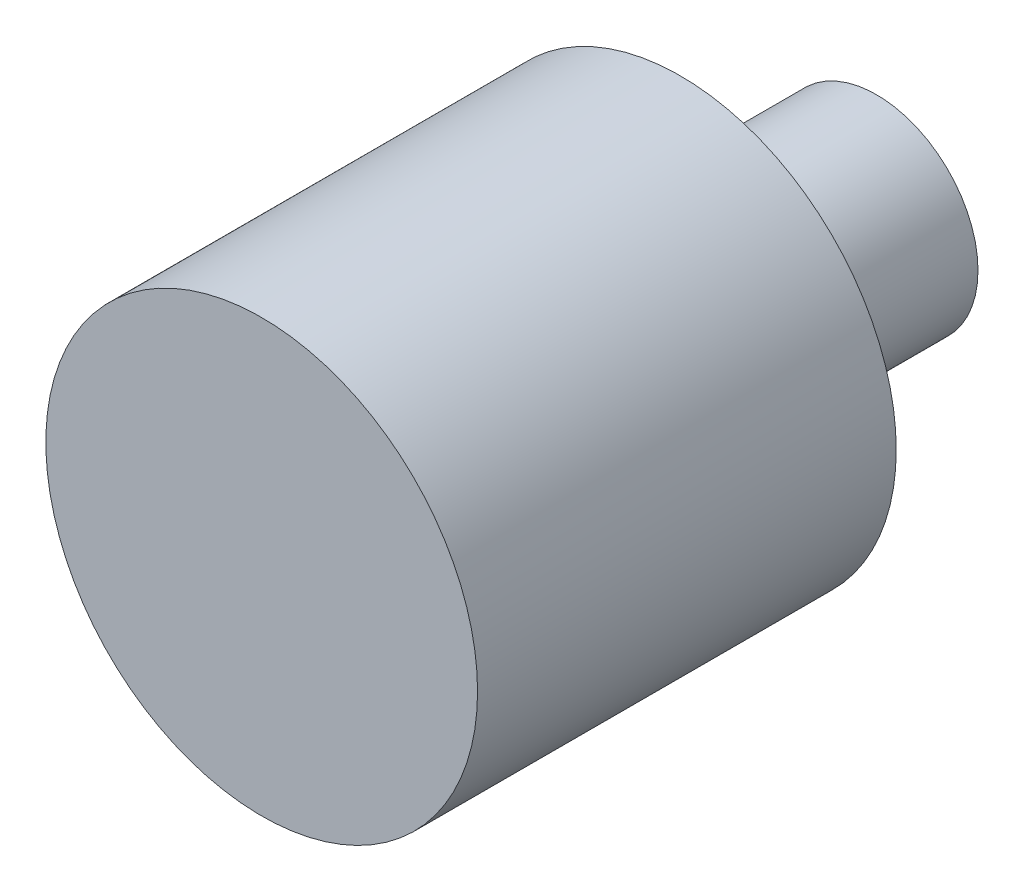
ISO-10303-21;
HEADER;
FILE_DESCRIPTION(('STEP AP214'),'2;1');
FILE_NAME('part.step','',(''),(''),'','','');
FILE_SCHEMA(('AUTOMOTIVE_DESIGN { 1 0 10303 214 1 1 1 1 }'));
ENDSEC;
DATA;
#1=APPLICATION_CONTEXT('core data for automotive mechanical design processes');
#2=APPLICATION_PROTOCOL_DEFINITION('international standard','automotive_design',2000,#1);
#3=PRODUCT_CONTEXT('',#1,'mechanical');
#4=PRODUCT('Part','Part','',(#3));
#5=PRODUCT_RELATED_PRODUCT_CATEGORY('part','',(#4));
#6=PRODUCT_DEFINITION_FORMATION('','',#4);
#7=PRODUCT_DEFINITION_CONTEXT('part definition',#1,'design');
#8=PRODUCT_DEFINITION('design','',#6,#7);
#9=PRODUCT_DEFINITION_SHAPE('','',#8);
#10=(LENGTH_UNIT() NAMED_UNIT(*) SI_UNIT(.MILLI.,.METRE.));
#11=(NAMED_UNIT(*) PLANE_ANGLE_UNIT() SI_UNIT($,.RADIAN.));
#12=(NAMED_UNIT(*) SI_UNIT($,.STERADIAN.) SOLID_ANGLE_UNIT());
#13=UNCERTAINTY_MEASURE_WITH_UNIT(LENGTH_MEASURE(1.E-05),#10,'distance_accuracy_value','');
#14=(GEOMETRIC_REPRESENTATION_CONTEXT(3) GLOBAL_UNCERTAINTY_ASSIGNED_CONTEXT((#13)) GLOBAL_UNIT_ASSIGNED_CONTEXT((#10,
#11,#12)) REPRESENTATION_CONTEXT('',''));
#15=CARTESIAN_POINT('',(0.,0.,0.));
#16=DIRECTION('',(0.,0.,1.));
#17=DIRECTION('',(1.,0.,0.));
#18=AXIS2_PLACEMENT_3D('',#15,#16,#17);
#19=CARTESIAN_POINT('',(0.,0.,-15.));
#20=DIRECTION('',(0.,0.,1.));
#21=DIRECTION('',(1.,0.,0.));
#22=AXIS2_PLACEMENT_3D('',#19,#20,#21);
#23=CYLINDRICAL_SURFACE('',#22,3.);
#24=CARTESIAN_POINT('',(0.,0.,0.));
#25=DIRECTION('',(0.,0.,1.));
#26=DIRECTION('',(1.,0.,0.));
#27=AXIS2_PLACEMENT_3D('',#24,#25,#26);
#28=CIRCLE('',#27,3.);
#29=CARTESIAN_POINT('',(3.,0.,0.));
#30=VERTEX_POINT('',#29);
#31=EDGE_CURVE('E47',#30,#30,#28,.F.);
#32=ORIENTED_EDGE('',*,*,#31,.T.);
#33=EDGE_LOOP('',(#32));
#34=FACE_BOUND('',#33,.T.);
#35=CARTESIAN_POINT('',(0.,0.,-4.));
#36=DIRECTION('',(0.,0.,-1.));
#37=DIRECTION('',(-1.,0.,0.));
#38=AXIS2_PLACEMENT_3D('',#35,#36,#37);
#39=CIRCLE('',#38,3.);
#40=CARTESIAN_POINT('',(-3.,0.,-4.));
#41=VERTEX_POINT('',#40);
#42=EDGE_CURVE('E11',#41,#41,#39,.T.);
#43=ORIENTED_EDGE('',*,*,#42,.F.);
#44=EDGE_LOOP('',(#43));
#45=FACE_BOUND('',#44,.T.);
#46=ADVANCED_FACE('F39',(#34,#45),#23,.T.);
#47=CARTESIAN_POINT('',(0.,0.,0.));
#48=DIRECTION('',(0.,0.,1.));
#49=DIRECTION('',(1.,0.,0.));
#50=AXIS2_PLACEMENT_3D('',#47,#48,#49);
#51=PLANE('',#50);
#52=CARTESIAN_POINT('',(0.,12.5,0.));
#53=DIRECTION('',(0.,0.,-1.));
#54=DIRECTION('',(-1.,0.,0.));
#55=AXIS2_PLACEMENT_3D('',#52,#53,#54);
#56=CIRCLE('',#55,1.24999999999999);
#57=CARTESIAN_POINT('',(-1.24999999999999,12.5,0.));
#58=VERTEX_POINT('',#57);
#59=EDGE_CURVE('E71',#58,#58,#56,.T.);
#60=ORIENTED_EDGE('',*,*,#59,.F.);
#61=EDGE_LOOP('',(#60));
#62=FACE_BOUND('',#61,.T.);
#63=CARTESIAN_POINT('',(-12.5,0.,0.));
#64=DIRECTION('',(0.,0.,-1.));
#65=DIRECTION('',(-1.,0.,0.));
#66=AXIS2_PLACEMENT_3D('',#63,#64,#65);
#67=CIRCLE('',#66,1.24999999999999);
#68=CARTESIAN_POINT('',(-13.75,0.,0.));
#69=VERTEX_POINT('',#68);
#70=EDGE_CURVE('E70',#69,#69,#67,.T.);
#71=ORIENTED_EDGE('',*,*,#70,.F.);
#72=EDGE_LOOP('',(#71));
#73=FACE_BOUND('',#72,.T.);
#74=CARTESIAN_POINT('',(0.,-12.5,0.));
#75=DIRECTION('',(0.,0.,-1.));
#76=DIRECTION('',(-1.,0.,0.));
#77=AXIS2_PLACEMENT_3D('',#74,#75,#76);
#78=CIRCLE('',#77,1.24999999999999);
#79=CARTESIAN_POINT('',(-1.24999999999999,-12.5,0.));
#80=VERTEX_POINT('',#79);
#81=EDGE_CURVE('E83',#80,#80,#78,.T.);
#82=ORIENTED_EDGE('',*,*,#81,.F.);
#83=EDGE_LOOP('',(#82));
#84=FACE_BOUND('',#83,.T.);
#85=CARTESIAN_POINT('',(12.5,0.,0.));
#86=DIRECTION('',(0.,0.,-1.));
#87=DIRECTION('',(-1.,0.,0.));
#88=AXIS2_PLACEMENT_3D('',#85,#86,#87);
#89=CIRCLE('',#88,1.24999999999999);
#90=CARTESIAN_POINT('',(11.25,0.,0.));
#91=VERTEX_POINT('',#90);
#92=EDGE_CURVE('E90',#91,#91,#89,.T.);
#93=ORIENTED_EDGE('',*,*,#92,.F.);
#94=EDGE_LOOP('',(#93));
#95=FACE_BOUND('',#94,.T.);
#96=CARTESIAN_POINT('',(0.,0.,0.));
#97=DIRECTION('',(0.,0.,1.));
#98=DIRECTION('',(1.,0.,0.));
#99=AXIS2_PLACEMENT_3D('',#96,#97,#98);
#100=CIRCLE('',#99,16.5);
#101=CARTESIAN_POINT('',(16.5,0.,0.));
#102=VERTEX_POINT('',#101);
#103=EDGE_CURVE('E96',#102,#102,#100,.T.);
#104=ORIENTED_EDGE('',*,*,#103,.F.);
#105=EDGE_LOOP('',(#104));
#106=FACE_BOUND('',#105,.T.);
#107=ORIENTED_EDGE('',*,*,#31,.F.);
#108=EDGE_LOOP('',(#107));
#109=FACE_BOUND('',#108,.T.);
#110=ADVANCED_FACE('F107',(#62,#73,#84,#95,#106,#109),#51,.F.);
#111=CARTESIAN_POINT('',(0.,0.,32.));
#112=DIRECTION('',(0.,0.,-1.));
#113=DIRECTION('',(-1.,0.,0.));
#114=AXIS2_PLACEMENT_3D('',#111,#112,#113);
#115=CYLINDRICAL_SURFACE('',#114,16.5);
#116=CARTESIAN_POINT('',(0.,0.,32.));
#117=DIRECTION('',(0.,0.,1.));
#118=DIRECTION('',(1.,0.,0.));
#119=AXIS2_PLACEMENT_3D('',#116,#117,#118);
#120=CIRCLE('',#119,16.5);
#121=CARTESIAN_POINT('',(16.5,0.,32.));
#122=VERTEX_POINT('',#121);
#123=EDGE_CURVE('E97',#122,#122,#120,.T.);
#124=ORIENTED_EDGE('',*,*,#123,.F.);
#125=EDGE_LOOP('',(#124));
#126=FACE_BOUND('',#125,.T.);
#127=ORIENTED_EDGE('',*,*,#103,.T.);
#128=EDGE_LOOP('',(#127));
#129=FACE_BOUND('',#128,.T.);
#130=ADVANCED_FACE('F41',(#126,#129),#115,.T.);
#131=CARTESIAN_POINT('',(0.,0.,32.));
#132=DIRECTION('',(0.,0.,1.));
#133=DIRECTION('',(1.,0.,0.));
#134=AXIS2_PLACEMENT_3D('',#131,#132,#133);
#135=PLANE('',#134);
#136=ORIENTED_EDGE('',*,*,#123,.T.);
#137=EDGE_LOOP('',(#136));
#138=FACE_BOUND('',#137,.T.);
#139=ADVANCED_FACE('F113',(#138),#135,.T.);
#140=CARTESIAN_POINT('',(12.5,0.,4.));
#141=DIRECTION('',(0.,0.,-1.));
#142=DIRECTION('',(-1.,0.,0.));
#143=AXIS2_PLACEMENT_3D('',#140,#141,#142);
#144=CONICAL_SURFACE('',#143,1.25,1.02974425867665);
#145=CARTESIAN_POINT('',(12.5,0.,4.75107577378445));
#146=VERTEX_POINT('',#145);
#147=VERTEX_LOOP('',#146);
#148=FACE_BOUND('',#147,.T.);
#149=CARTESIAN_POINT('',(12.5,0.,4.));
#150=DIRECTION('',(0.,0.,-1.));
#151=DIRECTION('',(-1.,0.,0.));
#152=AXIS2_PLACEMENT_3D('',#149,#150,#151);
#153=CIRCLE('',#152,1.25);
#154=CARTESIAN_POINT('',(11.25,0.,4.));
#155=VERTEX_POINT('',#154);
#156=EDGE_CURVE('E93',#155,#155,#153,.T.);
#157=ORIENTED_EDGE('',*,*,#156,.T.);
#158=EDGE_LOOP('',(#157));
#159=FACE_BOUND('',#158,.T.);
#160=ADVANCED_FACE('F121',(#148,#159),#144,.F.);
#161=CARTESIAN_POINT('',(12.5,0.,0.));
#162=DIRECTION('',(0.,0.,-1.));
#163=DIRECTION('',(-1.,0.,0.));
#164=AXIS2_PLACEMENT_3D('',#161,#162,#163);
#165=CYLINDRICAL_SURFACE('',#164,1.24999999999999);
#166=ORIENTED_EDGE('',*,*,#156,.F.);
#167=EDGE_LOOP('',(#166));
#168=FACE_BOUND('',#167,.T.);
#169=ORIENTED_EDGE('',*,*,#92,.T.);
#170=EDGE_LOOP('',(#169));
#171=FACE_BOUND('',#170,.T.);
#172=ADVANCED_FACE('F131',(#168,#171),#165,.F.);
#173=CARTESIAN_POINT('',(0.,-12.5,4.));
#174=DIRECTION('',(0.,0.,-1.));
#175=DIRECTION('',(-1.,0.,0.));
#176=AXIS2_PLACEMENT_3D('',#173,#174,#175);
#177=CONICAL_SURFACE('',#176,1.25,1.02974425867665);
#178=CARTESIAN_POINT('',(0.,-12.5,4.75107577378445));
#179=VERTEX_POINT('',#178);
#180=VERTEX_LOOP('',#179);
#181=FACE_BOUND('',#180,.T.);
#182=CARTESIAN_POINT('',(0.,-12.5,4.));
#183=DIRECTION('',(0.,0.,-1.));
#184=DIRECTION('',(-1.,0.,0.));
#185=AXIS2_PLACEMENT_3D('',#182,#183,#184);
#186=CIRCLE('',#185,1.25);
#187=CARTESIAN_POINT('',(-1.25,-12.5,4.));
#188=VERTEX_POINT('',#187);
#189=EDGE_CURVE('E87',#188,#188,#186,.T.);
#190=ORIENTED_EDGE('',*,*,#189,.T.);
#191=EDGE_LOOP('',(#190));
#192=FACE_BOUND('',#191,.T.);
#193=ADVANCED_FACE('F134',(#181,#192),#177,.F.);
#194=CARTESIAN_POINT('',(0.,-12.5,0.));
#195=DIRECTION('',(0.,0.,-1.));
#196=DIRECTION('',(-1.,0.,0.));
#197=AXIS2_PLACEMENT_3D('',#194,#195,#196);
#198=CYLINDRICAL_SURFACE('',#197,1.24999999999999);
#199=ORIENTED_EDGE('',*,*,#189,.F.);
#200=EDGE_LOOP('',(#199));
#201=FACE_BOUND('',#200,.T.);
#202=ORIENTED_EDGE('',*,*,#81,.T.);
#203=EDGE_LOOP('',(#202));
#204=FACE_BOUND('',#203,.T.);
#205=ADVANCED_FACE('F138',(#201,#204),#198,.F.);
#206=CARTESIAN_POINT('',(-12.5,0.,4.));
#207=DIRECTION('',(0.,0.,-1.));
#208=DIRECTION('',(-1.,0.,0.));
#209=AXIS2_PLACEMENT_3D('',#206,#207,#208);
#210=CONICAL_SURFACE('',#209,1.25,1.02974425867665);
#211=CARTESIAN_POINT('',(-12.5,0.,4.75107577378445));
#212=VERTEX_POINT('',#211);
#213=VERTEX_LOOP('',#212);
#214=FACE_BOUND('',#213,.T.);
#215=CARTESIAN_POINT('',(-12.5,0.,4.));
#216=DIRECTION('',(0.,0.,-1.));
#217=DIRECTION('',(-1.,0.,0.));
#218=AXIS2_PLACEMENT_3D('',#215,#216,#217);
#219=CIRCLE('',#218,1.25);
#220=CARTESIAN_POINT('',(-13.75,0.,4.));
#221=VERTEX_POINT('',#220);
#222=EDGE_CURVE('E74',#221,#221,#219,.T.);
#223=ORIENTED_EDGE('',*,*,#222,.T.);
#224=EDGE_LOOP('',(#223));
#225=FACE_BOUND('',#224,.T.);
#226=ADVANCED_FACE('F141',(#214,#225),#210,.F.);
#227=CARTESIAN_POINT('',(-12.5,0.,0.));
#228=DIRECTION('',(0.,0.,-1.));
#229=DIRECTION('',(-1.,0.,0.));
#230=AXIS2_PLACEMENT_3D('',#227,#228,#229);
#231=CYLINDRICAL_SURFACE('',#230,1.24999999999999);
#232=ORIENTED_EDGE('',*,*,#222,.F.);
#233=EDGE_LOOP('',(#232));
#234=FACE_BOUND('',#233,.T.);
#235=ORIENTED_EDGE('',*,*,#70,.T.);
#236=EDGE_LOOP('',(#235));
#237=FACE_BOUND('',#236,.T.);
#238=ADVANCED_FACE('F64',(#234,#237),#231,.F.);
#239=CARTESIAN_POINT('',(0.,12.5,4.));
#240=DIRECTION('',(0.,0.,-1.));
#241=DIRECTION('',(-1.,0.,0.));
#242=AXIS2_PLACEMENT_3D('',#239,#240,#241);
#243=CONICAL_SURFACE('',#242,1.25,1.02974425867665);
#244=CARTESIAN_POINT('',(0.,12.5,4.75107577378445));
#245=VERTEX_POINT('',#244);
#246=VERTEX_LOOP('',#245);
#247=FACE_BOUND('',#246,.T.);
#248=CARTESIAN_POINT('',(0.,12.5,4.));
#249=DIRECTION('',(0.,0.,-1.));
#250=DIRECTION('',(-1.,0.,0.));
#251=AXIS2_PLACEMENT_3D('',#248,#249,#250);
#252=CIRCLE('',#251,1.25);
#253=CARTESIAN_POINT('',(-1.25,12.5,4.));
#254=VERTEX_POINT('',#253);
#255=EDGE_CURVE('E68',#254,#254,#252,.T.);
#256=ORIENTED_EDGE('',*,*,#255,.T.);
#257=EDGE_LOOP('',(#256));
#258=FACE_BOUND('',#257,.T.);
#259=ADVANCED_FACE('F60',(#247,#258),#243,.F.);
#260=CARTESIAN_POINT('',(0.,12.5,0.));
#261=DIRECTION('',(0.,0.,-1.));
#262=DIRECTION('',(-1.,0.,0.));
#263=AXIS2_PLACEMENT_3D('',#260,#261,#262);
#264=CYLINDRICAL_SURFACE('',#263,1.24999999999999);
#265=ORIENTED_EDGE('',*,*,#255,.F.);
#266=EDGE_LOOP('',(#265));
#267=FACE_BOUND('',#266,.T.);
#268=ORIENTED_EDGE('',*,*,#59,.T.);
#269=EDGE_LOOP('',(#268));
#270=FACE_BOUND('',#269,.T.);
#271=ADVANCED_FACE('F63',(#267,#270),#264,.F.);
#272=CARTESIAN_POINT('',(0.,0.,-4.));
#273=DIRECTION('',(0.,0.,-1.));
#274=DIRECTION('',(-1.,0.,0.));
#275=AXIS2_PLACEMENT_3D('',#272,#273,#274);
#276=PLANE('',#275);
#277=CARTESIAN_POINT('',(0.,0.,-4.));
#278=DIRECTION('',(0.,0.,-1.));
#279=DIRECTION('',(-1.,0.,0.));
#280=AXIS2_PLACEMENT_3D('',#277,#278,#279);
#281=CIRCLE('',#280,7.75);
#282=CARTESIAN_POINT('',(-7.75,0.,-4.));
#283=VERTEX_POINT('',#282);
#284=EDGE_CURVE('E77',#283,#283,#281,.T.);
#285=ORIENTED_EDGE('',*,*,#284,.F.);
#286=EDGE_LOOP('',(#285));
#287=FACE_BOUND('',#286,.T.);
#288=ORIENTED_EDGE('',*,*,#42,.T.);
#289=EDGE_LOOP('',(#288));
#290=FACE_BOUND('',#289,.T.);
#291=ADVANCED_FACE('F151',(#287,#290),#276,.F.);
#292=CARTESIAN_POINT('',(0.,0.,-4.));
#293=DIRECTION('',(0.,0.,-1.));
#294=DIRECTION('',(-1.,0.,0.));
#295=AXIS2_PLACEMENT_3D('',#292,#293,#294);
#296=CYLINDRICAL_SURFACE('',#295,7.75);
#297=ORIENTED_EDGE('',*,*,#284,.T.);
#298=EDGE_LOOP('',(#297));
#299=FACE_BOUND('',#298,.T.);
#300=CARTESIAN_POINT('',(0.,0.,-15.));
#301=DIRECTION('',(0.,0.,-1.));
#302=DIRECTION('',(-1.,0.,0.));
#303=AXIS2_PLACEMENT_3D('',#300,#301,#302);
#304=CIRCLE('',#303,7.75);
#305=CARTESIAN_POINT('',(-7.75,0.,-15.));
#306=VERTEX_POINT('',#305);
#307=EDGE_CURVE('E164',#306,#306,#304,.T.);
#308=ORIENTED_EDGE('',*,*,#307,.F.);
#309=EDGE_LOOP('',(#308));
#310=FACE_BOUND('',#309,.T.);
#311=ADVANCED_FACE('F127',(#299,#310),#296,.T.);
#312=CARTESIAN_POINT('',(0.,0.,-15.));
#313=DIRECTION('',(0.,0.,-1.));
#314=DIRECTION('',(-1.,0.,0.));
#315=AXIS2_PLACEMENT_3D('',#312,#313,#314);
#316=PLANE('',#315);
#317=ORIENTED_EDGE('',*,*,#307,.T.);
#318=EDGE_LOOP('',(#317));
#319=FACE_BOUND('',#318,.T.);
#320=ADVANCED_FACE('F124',(#319),#316,.T.);
#321=CLOSED_SHELL('',(#46,#110,#130,#139,#160,#172,#193,#205,#226,#238,#259,#271,#291,#311,#320));
#322=MANIFOLD_SOLID_BREP('B2',#321);
#323=ADVANCED_BREP_SHAPE_REPRESENTATION('',(#18,#322),#14);
#324=SHAPE_DEFINITION_REPRESENTATION(#9,#323);
ENDSEC;
END-ISO-10303-21;
